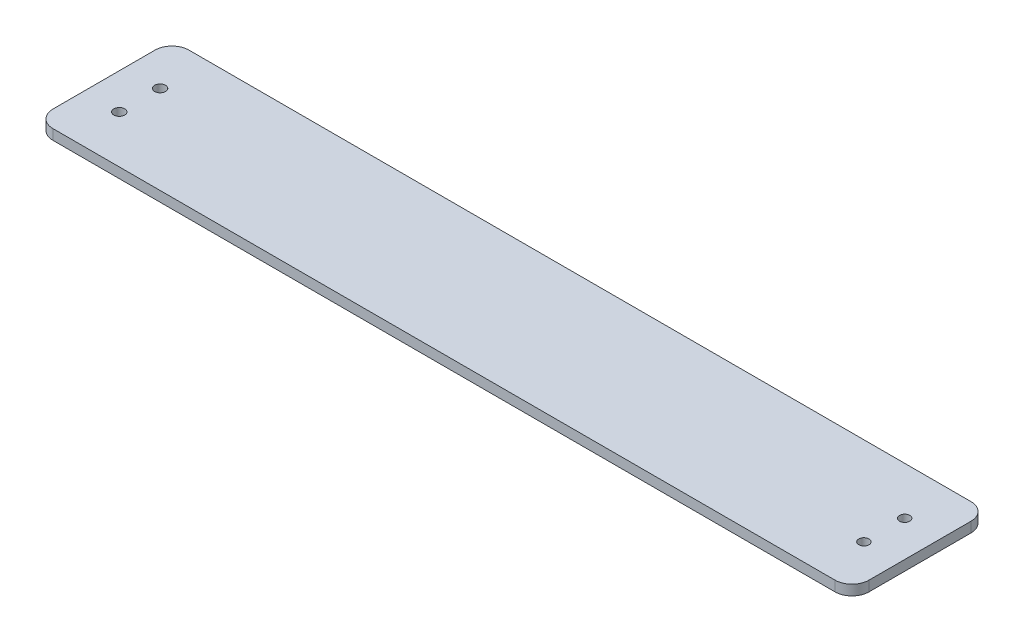
ISO-10303-21;
HEADER;
FILE_DESCRIPTION(('STEP AP214'),'2;1');
FILE_NAME('part.step','',(''),(''),'','','');
FILE_SCHEMA(('AUTOMOTIVE_DESIGN { 1 0 10303 214 1 1 1 1 }'));
ENDSEC;
DATA;
#1=APPLICATION_CONTEXT('core data for automotive mechanical design processes');
#2=APPLICATION_PROTOCOL_DEFINITION('international standard','automotive_design',2000,#1);
#3=PRODUCT_CONTEXT('',#1,'mechanical');
#4=PRODUCT('Part','Part','',(#3));
#5=PRODUCT_RELATED_PRODUCT_CATEGORY('part','',(#4));
#6=PRODUCT_DEFINITION_FORMATION('','',#4);
#7=PRODUCT_DEFINITION_CONTEXT('part definition',#1,'design');
#8=PRODUCT_DEFINITION('design','',#6,#7);
#9=PRODUCT_DEFINITION_SHAPE('','',#8);
#10=(LENGTH_UNIT() NAMED_UNIT(*) SI_UNIT(.MILLI.,.METRE.));
#11=(NAMED_UNIT(*) PLANE_ANGLE_UNIT() SI_UNIT($,.RADIAN.));
#12=(NAMED_UNIT(*) SI_UNIT($,.STERADIAN.) SOLID_ANGLE_UNIT());
#13=UNCERTAINTY_MEASURE_WITH_UNIT(LENGTH_MEASURE(1.E-05),#10,'distance_accuracy_value','');
#14=(GEOMETRIC_REPRESENTATION_CONTEXT(3) GLOBAL_UNCERTAINTY_ASSIGNED_CONTEXT((#13)) GLOBAL_UNIT_ASSIGNED_CONTEXT((#10,
#11,#12)) REPRESENTATION_CONTEXT('',''));
#15=CARTESIAN_POINT('',(0.,0.,0.));
#16=DIRECTION('',(0.,0.,1.));
#17=DIRECTION('',(1.,0.,0.));
#18=AXIS2_PLACEMENT_3D('',#15,#16,#17);
#19=CARTESIAN_POINT('',(115.,3.,4.99999999999989));
#20=DIRECTION('',(0.,1.,0.));
#21=DIRECTION('',(0.,0.,1.));
#22=AXIS2_PLACEMENT_3D('',#19,#20,#21);
#23=PLANE('',#22);
#24=CARTESIAN_POINT('',(109.499999999968,3.,25.9999999999972));
#25=DIRECTION('',(0.,1.,0.));
#26=DIRECTION('',(0.,0.,1.));
#27=AXIS2_PLACEMENT_3D('',#24,#25,#26);
#28=CIRCLE('',#27,1.50000000000006);
#29=CARTESIAN_POINT('',(109.499999999968,3.,27.4999999999973));
#30=VERTEX_POINT('',#29);
#31=EDGE_CURVE('E190',#30,#30,#28,.T.);
#32=ORIENTED_EDGE('',*,*,#31,.F.);
#33=EDGE_LOOP('',(#32));
#34=FACE_BOUND('',#33,.T.);
#35=CARTESIAN_POINT('',(-109.500000000032,3.,25.9999999999972));
#36=DIRECTION('',(0.,1.,0.));
#37=DIRECTION('',(0.,0.,1.));
#38=AXIS2_PLACEMENT_3D('',#35,#36,#37);
#39=CIRCLE('',#38,1.59999999999982);
#40=CARTESIAN_POINT('',(-109.500000000032,3.,27.5999999999971));
#41=VERTEX_POINT('',#40);
#42=EDGE_CURVE('E136',#41,#41,#39,.T.);
#43=ORIENTED_EDGE('',*,*,#42,.F.);
#44=EDGE_LOOP('',(#43));
#45=FACE_BOUND('',#44,.T.);
#46=CARTESIAN_POINT('',(115.,3.,4.99999999999989));
#47=DIRECTION('',(0.,1.,0.));
#48=DIRECTION('',(0.,0.,1.));
#49=AXIS2_PLACEMENT_3D('',#46,#47,#48);
#50=CIRCLE('',#49,4.99999999999989);
#51=CARTESIAN_POINT('',(120.,3.,5.));
#52=VERTEX_POINT('',#51);
#53=CARTESIAN_POINT('',(115.,3.,0.));
#54=VERTEX_POINT('',#53);
#55=EDGE_CURVE('E147',#52,#54,#50,.T.);
#56=ORIENTED_EDGE('',*,*,#55,.T.);
#57=DIRECTION('',(-1.,0.,0.));
#58=VECTOR('',#57,1.);
#59=CARTESIAN_POINT('',(-115.,3.,0.));
#60=LINE('',#59,#58);
#61=CARTESIAN_POINT('',(-115.,3.,0.));
#62=VERTEX_POINT('',#61);
#63=EDGE_CURVE('E95',#54,#62,#60,.T.);
#64=ORIENTED_EDGE('',*,*,#63,.T.);
#65=CARTESIAN_POINT('',(-115.,3.,4.99999999999989));
#66=DIRECTION('',(0.,1.,0.));
#67=DIRECTION('',(0.,0.,1.));
#68=AXIS2_PLACEMENT_3D('',#65,#66,#67);
#69=CIRCLE('',#68,4.99999999999989);
#70=CARTESIAN_POINT('',(-120.,3.,5.));
#71=VERTEX_POINT('',#70);
#72=EDGE_CURVE('E162',#62,#71,#69,.T.);
#73=ORIENTED_EDGE('',*,*,#72,.T.);
#74=DIRECTION('',(0.,0.,1.));
#75=VECTOR('',#74,1.);
#76=CARTESIAN_POINT('',(-120.,3.,34.9999999999973));
#77=LINE('',#76,#75);
#78=CARTESIAN_POINT('',(-120.,3.,34.9999999999973));
#79=VERTEX_POINT('',#78);
#80=EDGE_CURVE('E175',#71,#79,#77,.T.);
#81=ORIENTED_EDGE('',*,*,#80,.T.);
#82=CARTESIAN_POINT('',(-115.,3.,34.9999999999969));
#83=DIRECTION('',(0.,1.,0.));
#84=DIRECTION('',(0.,0.,1.));
#85=AXIS2_PLACEMENT_3D('',#82,#83,#84);
#86=CIRCLE('',#85,5.00000000000056);
#87=CARTESIAN_POINT('',(-115.,3.,39.9999999999973));
#88=VERTEX_POINT('',#87);
#89=EDGE_CURVE('E114',#79,#88,#86,.T.);
#90=ORIENTED_EDGE('',*,*,#89,.T.);
#91=DIRECTION('',(1.,0.,0.));
#92=VECTOR('',#91,1.);
#93=CARTESIAN_POINT('',(115.,3.,39.9999999999973));
#94=LINE('',#93,#92);
#95=CARTESIAN_POINT('',(115.,3.,39.9999999999973));
#96=VERTEX_POINT('',#95);
#97=EDGE_CURVE('E108',#88,#96,#94,.T.);
#98=ORIENTED_EDGE('',*,*,#97,.T.);
#99=CARTESIAN_POINT('',(115.,3.,34.9999999999974));
#100=DIRECTION('',(0.,1.,0.));
#101=DIRECTION('',(0.,0.,1.));
#102=AXIS2_PLACEMENT_3D('',#99,#100,#101);
#103=CIRCLE('',#102,4.99999999999989);
#104=CARTESIAN_POINT('',(120.,3.,34.9999999999973));
#105=VERTEX_POINT('',#104);
#106=EDGE_CURVE('E112',#96,#105,#103,.T.);
#107=ORIENTED_EDGE('',*,*,#106,.T.);
#108=DIRECTION('',(0.,0.,-1.));
#109=VECTOR('',#108,1.);
#110=CARTESIAN_POINT('',(120.,3.,5.));
#111=LINE('',#110,#109);
#112=EDGE_CURVE('E52',#105,#52,#111,.T.);
#113=ORIENTED_EDGE('',*,*,#112,.T.);
#114=EDGE_LOOP('',(#56,#64,#73,#81,#90,#98,#107,#113));
#115=FACE_BOUND('',#114,.T.);
#116=CARTESIAN_POINT('',(109.499999999968,3.,13.9999999999973));
#117=DIRECTION('',(0.,1.,0.));
#118=DIRECTION('',(0.,0.,1.));
#119=AXIS2_PLACEMENT_3D('',#116,#117,#118);
#120=CIRCLE('',#119,1.50000000000006);
#121=CARTESIAN_POINT('',(109.499999999968,3.,15.4999999999973));
#122=VERTEX_POINT('',#121);
#123=EDGE_CURVE('E184',#122,#122,#120,.T.);
#124=ORIENTED_EDGE('',*,*,#123,.F.);
#125=EDGE_LOOP('',(#124));
#126=FACE_BOUND('',#125,.T.);
#127=CARTESIAN_POINT('',(-109.500000000032,3.,13.9999999999973));
#128=DIRECTION('',(0.,1.,0.));
#129=DIRECTION('',(0.,0.,1.));
#130=AXIS2_PLACEMENT_3D('',#127,#128,#129);
#131=CIRCLE('',#130,1.59999999999982);
#132=CARTESIAN_POINT('',(-109.500000000032,3.,15.5999999999971));
#133=VERTEX_POINT('',#132);
#134=EDGE_CURVE('E196',#133,#133,#131,.T.);
#135=ORIENTED_EDGE('',*,*,#134,.F.);
#136=EDGE_LOOP('',(#135));
#137=FACE_BOUND('',#136,.T.);
#138=ADVANCED_FACE('F35',(#34,#45,#115,#126,#137),#23,.T.);
#139=CARTESIAN_POINT('',(115.,0.,4.99999999999989));
#140=DIRECTION('',(0.,1.,0.));
#141=DIRECTION('',(0.,0.,1.));
#142=AXIS2_PLACEMENT_3D('',#139,#140,#141);
#143=PLANE('',#142);
#144=CARTESIAN_POINT('',(115.,0.,4.99999999999989));
#145=DIRECTION('',(0.,1.,0.));
#146=DIRECTION('',(0.,0.,1.));
#147=AXIS2_PLACEMENT_3D('',#144,#145,#146);
#148=CIRCLE('',#147,4.99999999999989);
#149=CARTESIAN_POINT('',(120.,0.,5.));
#150=VERTEX_POINT('',#149);
#151=CARTESIAN_POINT('',(115.,0.,0.));
#152=VERTEX_POINT('',#151);
#153=EDGE_CURVE('E132',#150,#152,#148,.T.);
#154=ORIENTED_EDGE('',*,*,#153,.F.);
#155=DIRECTION('',(0.,0.,-1.));
#156=VECTOR('',#155,1.);
#157=CARTESIAN_POINT('',(120.,0.,5.));
#158=LINE('',#157,#156);
#159=CARTESIAN_POINT('',(120.,0.,34.9999999999973));
#160=VERTEX_POINT('',#159);
#161=EDGE_CURVE('E87',#160,#150,#158,.T.);
#162=ORIENTED_EDGE('',*,*,#161,.F.);
#163=CARTESIAN_POINT('',(115.,0.,34.9999999999974));
#164=DIRECTION('',(0.,1.,0.));
#165=DIRECTION('',(0.,0.,1.));
#166=AXIS2_PLACEMENT_3D('',#163,#164,#165);
#167=CIRCLE('',#166,4.99999999999989);
#168=CARTESIAN_POINT('',(115.,0.,39.9999999999973));
#169=VERTEX_POINT('',#168);
#170=EDGE_CURVE('E81',#169,#160,#167,.T.);
#171=ORIENTED_EDGE('',*,*,#170,.F.);
#172=DIRECTION('',(1.,0.,0.));
#173=VECTOR('',#172,1.);
#174=CARTESIAN_POINT('',(115.,0.,39.9999999999973));
#175=LINE('',#174,#173);
#176=CARTESIAN_POINT('',(-115.,0.,39.9999999999973));
#177=VERTEX_POINT('',#176);
#178=EDGE_CURVE('E122',#177,#169,#175,.T.);
#179=ORIENTED_EDGE('',*,*,#178,.F.);
#180=CARTESIAN_POINT('',(-115.,0.,34.9999999999969));
#181=DIRECTION('',(0.,1.,0.));
#182=DIRECTION('',(0.,0.,1.));
#183=AXIS2_PLACEMENT_3D('',#180,#181,#182);
#184=CIRCLE('',#183,5.00000000000056);
#185=CARTESIAN_POINT('',(-120.,0.,34.9999999999973));
#186=VERTEX_POINT('',#185);
#187=EDGE_CURVE('E142',#186,#177,#184,.T.);
#188=ORIENTED_EDGE('',*,*,#187,.F.);
#189=DIRECTION('',(0.,0.,1.));
#190=VECTOR('',#189,1.);
#191=CARTESIAN_POINT('',(-120.,0.,34.9999999999973));
#192=LINE('',#191,#190);
#193=CARTESIAN_POINT('',(-120.,0.,5.));
#194=VERTEX_POINT('',#193);
#195=EDGE_CURVE('E140',#194,#186,#192,.T.);
#196=ORIENTED_EDGE('',*,*,#195,.F.);
#197=CARTESIAN_POINT('',(-115.,0.,4.99999999999989));
#198=DIRECTION('',(0.,1.,0.));
#199=DIRECTION('',(0.,0.,1.));
#200=AXIS2_PLACEMENT_3D('',#197,#198,#199);
#201=CIRCLE('',#200,4.99999999999989);
#202=CARTESIAN_POINT('',(-115.,0.,0.));
#203=VERTEX_POINT('',#202);
#204=EDGE_CURVE('E138',#203,#194,#201,.T.);
#205=ORIENTED_EDGE('',*,*,#204,.F.);
#206=DIRECTION('',(-1.,0.,0.));
#207=VECTOR('',#206,1.);
#208=CARTESIAN_POINT('',(-115.,0.,0.));
#209=LINE('',#208,#207);
#210=EDGE_CURVE('E135',#152,#203,#209,.T.);
#211=ORIENTED_EDGE('',*,*,#210,.F.);
#212=EDGE_LOOP('',(#154,#162,#171,#179,#188,#196,#205,#211));
#213=FACE_BOUND('',#212,.T.);
#214=CARTESIAN_POINT('',(-109.500000000032,0.,25.9999999999972));
#215=DIRECTION('',(0.,1.,0.));
#216=DIRECTION('',(0.,0.,1.));
#217=AXIS2_PLACEMENT_3D('',#214,#215,#216);
#218=CIRCLE('',#217,1.59999999999982);
#219=CARTESIAN_POINT('',(-109.500000000032,0.,27.5999999999971));
#220=VERTEX_POINT('',#219);
#221=EDGE_CURVE('E181',#220,#220,#218,.T.);
#222=ORIENTED_EDGE('',*,*,#221,.T.);
#223=EDGE_LOOP('',(#222));
#224=FACE_BOUND('',#223,.T.);
#225=CARTESIAN_POINT('',(109.499999999968,0.,13.9999999999973));
#226=DIRECTION('',(0.,1.,0.));
#227=DIRECTION('',(0.,0.,1.));
#228=AXIS2_PLACEMENT_3D('',#225,#226,#227);
#229=CIRCLE('',#228,1.50000000000006);
#230=CARTESIAN_POINT('',(109.499999999968,0.,15.4999999999973));
#231=VERTEX_POINT('',#230);
#232=EDGE_CURVE('E187',#231,#231,#229,.T.);
#233=ORIENTED_EDGE('',*,*,#232,.T.);
#234=EDGE_LOOP('',(#233));
#235=FACE_BOUND('',#234,.T.);
#236=CARTESIAN_POINT('',(109.499999999968,0.,25.9999999999972));
#237=DIRECTION('',(0.,1.,0.));
#238=DIRECTION('',(0.,0.,1.));
#239=AXIS2_PLACEMENT_3D('',#236,#237,#238);
#240=CIRCLE('',#239,1.50000000000006);
#241=CARTESIAN_POINT('',(109.499999999968,0.,27.4999999999973));
#242=VERTEX_POINT('',#241);
#243=EDGE_CURVE('E193',#242,#242,#240,.T.);
#244=ORIENTED_EDGE('',*,*,#243,.T.);
#245=EDGE_LOOP('',(#244));
#246=FACE_BOUND('',#245,.T.);
#247=CARTESIAN_POINT('',(-109.500000000032,0.,13.9999999999973));
#248=DIRECTION('',(0.,1.,0.));
#249=DIRECTION('',(0.,0.,1.));
#250=AXIS2_PLACEMENT_3D('',#247,#248,#249);
#251=CIRCLE('',#250,1.59999999999982);
#252=CARTESIAN_POINT('',(-109.500000000032,0.,15.5999999999971));
#253=VERTEX_POINT('',#252);
#254=EDGE_CURVE('E199',#253,#253,#251,.T.);
#255=ORIENTED_EDGE('',*,*,#254,.T.);
#256=EDGE_LOOP('',(#255));
#257=FACE_BOUND('',#256,.T.);
#258=ADVANCED_FACE('F166',(#213,#224,#235,#246,#257),#143,.F.);
#259=CARTESIAN_POINT('',(115.,3.,4.99999999999989));
#260=DIRECTION('',(0.,-1.,0.));
#261=DIRECTION('',(0.,0.,-1.));
#262=AXIS2_PLACEMENT_3D('',#259,#260,#261);
#263=CYLINDRICAL_SURFACE('',#262,4.99999999999989);
#264=ORIENTED_EDGE('',*,*,#153,.T.);
#265=DIRECTION('',(0.,-1.,0.));
#266=VECTOR('',#265,1.);
#267=CARTESIAN_POINT('',(115.,3.,0.));
#268=LINE('',#267,#266);
#269=EDGE_CURVE('E11',#54,#152,#268,.T.);
#270=ORIENTED_EDGE('',*,*,#269,.F.);
#271=ORIENTED_EDGE('',*,*,#55,.F.);
#272=DIRECTION('',(0.,-1.,0.));
#273=VECTOR('',#272,1.);
#274=CARTESIAN_POINT('',(120.,3.,5.));
#275=LINE('',#274,#273);
#276=EDGE_CURVE('E128',#52,#150,#275,.T.);
#277=ORIENTED_EDGE('',*,*,#276,.T.);
#278=EDGE_LOOP('',(#264,#270,#271,#277));
#279=FACE_BOUND('',#278,.T.);
#280=ADVANCED_FACE('F37',(#279),#263,.T.);
#281=CARTESIAN_POINT('',(-115.,3.,0.));
#282=DIRECTION('',(0.,0.,1.));
#283=DIRECTION('',(1.,0.,0.));
#284=AXIS2_PLACEMENT_3D('',#281,#282,#283);
#285=PLANE('',#284);
#286=ORIENTED_EDGE('',*,*,#210,.T.);
#287=DIRECTION('',(0.,-1.,0.));
#288=VECTOR('',#287,1.);
#289=CARTESIAN_POINT('',(-115.,3.,0.));
#290=LINE('',#289,#288);
#291=EDGE_CURVE('E44',#62,#203,#290,.T.);
#292=ORIENTED_EDGE('',*,*,#291,.F.);
#293=ORIENTED_EDGE('',*,*,#63,.F.);
#294=ORIENTED_EDGE('',*,*,#269,.T.);
#295=EDGE_LOOP('',(#286,#292,#293,#294));
#296=FACE_BOUND('',#295,.T.);
#297=ADVANCED_FACE('F233',(#296),#285,.F.);
#298=CARTESIAN_POINT('',(-115.,3.,4.99999999999989));
#299=DIRECTION('',(0.,-1.,0.));
#300=DIRECTION('',(0.,0.,-1.));
#301=AXIS2_PLACEMENT_3D('',#298,#299,#300);
#302=CYLINDRICAL_SURFACE('',#301,4.99999999999989);
#303=ORIENTED_EDGE('',*,*,#204,.T.);
#304=DIRECTION('',(0.,-1.,0.));
#305=VECTOR('',#304,1.);
#306=CARTESIAN_POINT('',(-120.,3.,5.));
#307=LINE('',#306,#305);
#308=EDGE_CURVE('E154',#71,#194,#307,.T.);
#309=ORIENTED_EDGE('',*,*,#308,.F.);
#310=ORIENTED_EDGE('',*,*,#72,.F.);
#311=ORIENTED_EDGE('',*,*,#291,.T.);
#312=EDGE_LOOP('',(#303,#309,#310,#311));
#313=FACE_BOUND('',#312,.T.);
#314=ADVANCED_FACE('F160',(#313),#302,.T.);
#315=CARTESIAN_POINT('',(-120.,3.,34.9999999999973));
#316=DIRECTION('',(1.,0.,0.));
#317=DIRECTION('',(0.,0.,-1.));
#318=AXIS2_PLACEMENT_3D('',#315,#316,#317);
#319=PLANE('',#318);
#320=ORIENTED_EDGE('',*,*,#195,.T.);
#321=DIRECTION('',(0.,-1.,0.));
#322=VECTOR('',#321,1.);
#323=CARTESIAN_POINT('',(-120.,3.,34.9999999999973));
#324=LINE('',#323,#322);
#325=EDGE_CURVE('E151',#79,#186,#324,.T.);
#326=ORIENTED_EDGE('',*,*,#325,.F.);
#327=ORIENTED_EDGE('',*,*,#80,.F.);
#328=ORIENTED_EDGE('',*,*,#308,.T.);
#329=EDGE_LOOP('',(#320,#326,#327,#328));
#330=FACE_BOUND('',#329,.T.);
#331=ADVANCED_FACE('F171',(#330),#319,.F.);
#332=CARTESIAN_POINT('',(-115.,3.,34.9999999999969));
#333=DIRECTION('',(0.,-1.,0.));
#334=DIRECTION('',(0.,0.,-1.));
#335=AXIS2_PLACEMENT_3D('',#332,#333,#334);
#336=CYLINDRICAL_SURFACE('',#335,5.00000000000056);
#337=ORIENTED_EDGE('',*,*,#187,.T.);
#338=DIRECTION('',(0.,-1.,0.));
#339=VECTOR('',#338,1.);
#340=CARTESIAN_POINT('',(-115.,3.,39.9999999999973));
#341=LINE('',#340,#339);
#342=EDGE_CURVE('E123',#88,#177,#341,.T.);
#343=ORIENTED_EDGE('',*,*,#342,.F.);
#344=ORIENTED_EDGE('',*,*,#89,.F.);
#345=ORIENTED_EDGE('',*,*,#325,.T.);
#346=EDGE_LOOP('',(#337,#343,#344,#345));
#347=FACE_BOUND('',#346,.T.);
#348=ADVANCED_FACE('F174',(#347),#336,.T.);
#349=CARTESIAN_POINT('',(115.,3.,39.9999999999973));
#350=DIRECTION('',(0.,0.,-1.));
#351=DIRECTION('',(-1.,0.,0.));
#352=AXIS2_PLACEMENT_3D('',#349,#350,#351);
#353=PLANE('',#352);
#354=ORIENTED_EDGE('',*,*,#178,.T.);
#355=DIRECTION('',(0.,-1.,0.));
#356=VECTOR('',#355,1.);
#357=CARTESIAN_POINT('',(115.,3.,39.9999999999973));
#358=LINE('',#357,#356);
#359=EDGE_CURVE('E119',#96,#169,#358,.T.);
#360=ORIENTED_EDGE('',*,*,#359,.F.);
#361=ORIENTED_EDGE('',*,*,#97,.F.);
#362=ORIENTED_EDGE('',*,*,#342,.T.);
#363=EDGE_LOOP('',(#354,#360,#361,#362));
#364=FACE_BOUND('',#363,.T.);
#365=ADVANCED_FACE('F120',(#364),#353,.F.);
#366=CARTESIAN_POINT('',(115.,3.,34.9999999999974));
#367=DIRECTION('',(0.,-1.,0.));
#368=DIRECTION('',(0.,0.,-1.));
#369=AXIS2_PLACEMENT_3D('',#366,#367,#368);
#370=CYLINDRICAL_SURFACE('',#369,4.99999999999989);
#371=ORIENTED_EDGE('',*,*,#170,.T.);
#372=DIRECTION('',(0.,-1.,0.));
#373=VECTOR('',#372,1.);
#374=CARTESIAN_POINT('',(120.,3.,34.9999999999973));
#375=LINE('',#374,#373);
#376=EDGE_CURVE('E124',#105,#160,#375,.T.);
#377=ORIENTED_EDGE('',*,*,#376,.F.);
#378=ORIENTED_EDGE('',*,*,#106,.F.);
#379=ORIENTED_EDGE('',*,*,#359,.T.);
#380=EDGE_LOOP('',(#371,#377,#378,#379));
#381=FACE_BOUND('',#380,.T.);
#382=ADVANCED_FACE('F126',(#381),#370,.T.);
#383=CARTESIAN_POINT('',(120.,3.,5.));
#384=DIRECTION('',(-1.,0.,0.));
#385=DIRECTION('',(0.,0.,1.));
#386=AXIS2_PLACEMENT_3D('',#383,#384,#385);
#387=PLANE('',#386);
#388=ORIENTED_EDGE('',*,*,#161,.T.);
#389=ORIENTED_EDGE('',*,*,#276,.F.);
#390=ORIENTED_EDGE('',*,*,#112,.F.);
#391=ORIENTED_EDGE('',*,*,#376,.T.);
#392=EDGE_LOOP('',(#388,#389,#390,#391));
#393=FACE_BOUND('',#392,.T.);
#394=ADVANCED_FACE('F221',(#393),#387,.F.);
#395=CARTESIAN_POINT('',(-109.500000000032,3.,25.9999999999972));
#396=DIRECTION('',(0.,-1.,0.));
#397=DIRECTION('',(0.,0.,-1.));
#398=AXIS2_PLACEMENT_3D('',#395,#396,#397);
#399=CYLINDRICAL_SURFACE('',#398,1.59999999999982);
#400=ORIENTED_EDGE('',*,*,#42,.T.);
#401=EDGE_LOOP('',(#400));
#402=FACE_BOUND('',#401,.T.);
#403=ORIENTED_EDGE('',*,*,#221,.F.);
#404=EDGE_LOOP('',(#403));
#405=FACE_BOUND('',#404,.T.);
#406=ADVANCED_FACE('F218',(#402,#405),#399,.F.);
#407=CARTESIAN_POINT('',(109.499999999968,3.,13.9999999999973));
#408=DIRECTION('',(0.,-1.,0.));
#409=DIRECTION('',(0.,0.,-1.));
#410=AXIS2_PLACEMENT_3D('',#407,#408,#409);
#411=CYLINDRICAL_SURFACE('',#410,1.50000000000006);
#412=ORIENTED_EDGE('',*,*,#123,.T.);
#413=EDGE_LOOP('',(#412));
#414=FACE_BOUND('',#413,.T.);
#415=ORIENTED_EDGE('',*,*,#232,.F.);
#416=EDGE_LOOP('',(#415));
#417=FACE_BOUND('',#416,.T.);
#418=ADVANCED_FACE('F297',(#414,#417),#411,.F.);
#419=CARTESIAN_POINT('',(109.499999999968,3.,25.9999999999972));
#420=DIRECTION('',(0.,-1.,0.));
#421=DIRECTION('',(0.,0.,-1.));
#422=AXIS2_PLACEMENT_3D('',#419,#420,#421);
#423=CYLINDRICAL_SURFACE('',#422,1.50000000000006);
#424=ORIENTED_EDGE('',*,*,#31,.T.);
#425=EDGE_LOOP('',(#424));
#426=FACE_BOUND('',#425,.T.);
#427=ORIENTED_EDGE('',*,*,#243,.F.);
#428=EDGE_LOOP('',(#427));
#429=FACE_BOUND('',#428,.T.);
#430=ADVANCED_FACE('F305',(#426,#429),#423,.F.);
#431=CARTESIAN_POINT('',(-109.500000000032,3.,13.9999999999973));
#432=DIRECTION('',(0.,-1.,0.));
#433=DIRECTION('',(0.,0.,-1.));
#434=AXIS2_PLACEMENT_3D('',#431,#432,#433);
#435=CYLINDRICAL_SURFACE('',#434,1.59999999999982);
#436=ORIENTED_EDGE('',*,*,#134,.T.);
#437=EDGE_LOOP('',(#436));
#438=FACE_BOUND('',#437,.T.);
#439=ORIENTED_EDGE('',*,*,#254,.F.);
#440=EDGE_LOOP('',(#439));
#441=FACE_BOUND('',#440,.T.);
#442=ADVANCED_FACE('F205',(#438,#441),#435,.F.);
#443=CLOSED_SHELL('',(#138,#258,#280,#297,#314,#331,#348,#365,#382,#394,#406,#418,#430,#442));
#444=MANIFOLD_SOLID_BREP('B2',#443);
#445=ADVANCED_BREP_SHAPE_REPRESENTATION('',(#18,#444),#14);
#446=SHAPE_DEFINITION_REPRESENTATION(#9,#445);
ENDSEC;
END-ISO-10303-21;
